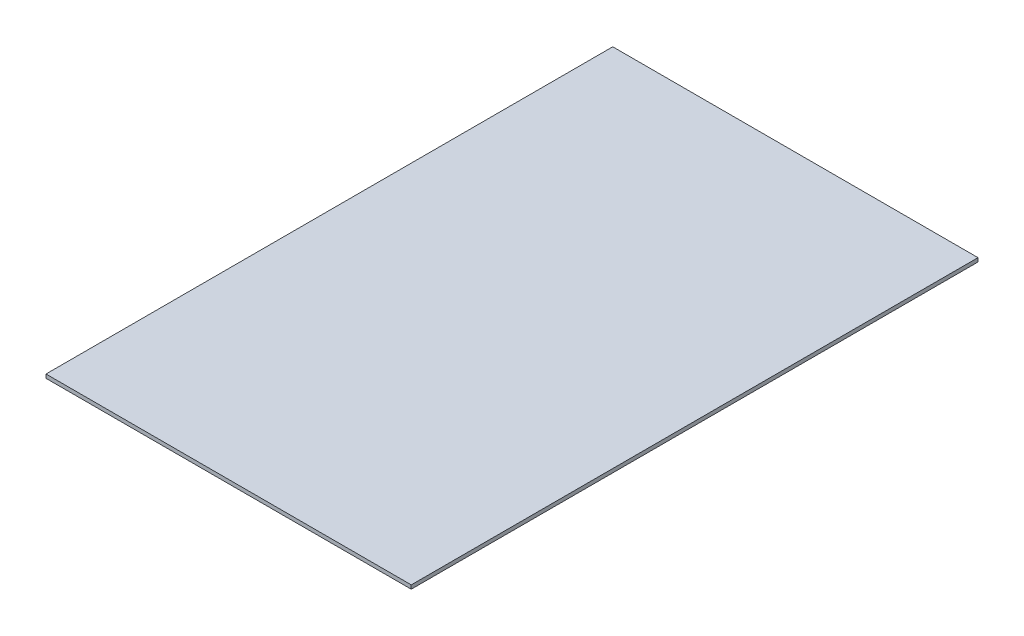
ISO-10303-21;
HEADER;
FILE_DESCRIPTION(('STEP AP214'),'2;1');
FILE_NAME('part.step','',(''),(''),'','','');
FILE_SCHEMA(('AUTOMOTIVE_DESIGN { 1 0 10303 214 1 1 1 1 }'));
ENDSEC;
DATA;
#1=APPLICATION_CONTEXT('core data for automotive mechanical design processes');
#2=APPLICATION_PROTOCOL_DEFINITION('international standard','automotive_design',2000,#1);
#3=PRODUCT_CONTEXT('',#1,'mechanical');
#4=PRODUCT('Part','Part','',(#3));
#5=PRODUCT_RELATED_PRODUCT_CATEGORY('part','',(#4));
#6=PRODUCT_DEFINITION_FORMATION('','',#4);
#7=PRODUCT_DEFINITION_CONTEXT('part definition',#1,'design');
#8=PRODUCT_DEFINITION('design','',#6,#7);
#9=PRODUCT_DEFINITION_SHAPE('','',#8);
#10=(LENGTH_UNIT() NAMED_UNIT(*) SI_UNIT(.MILLI.,.METRE.));
#11=(NAMED_UNIT(*) PLANE_ANGLE_UNIT() SI_UNIT($,.RADIAN.));
#12=(NAMED_UNIT(*) SI_UNIT($,.STERADIAN.) SOLID_ANGLE_UNIT());
#13=UNCERTAINTY_MEASURE_WITH_UNIT(LENGTH_MEASURE(1.E-05),#10,'distance_accuracy_value','');
#14=(GEOMETRIC_REPRESENTATION_CONTEXT(3) GLOBAL_UNCERTAINTY_ASSIGNED_CONTEXT((#13)) GLOBAL_UNIT_ASSIGNED_CONTEXT((#10,
#11,#12)) REPRESENTATION_CONTEXT('',''));
#15=CARTESIAN_POINT('',(0.,0.,0.));
#16=DIRECTION('',(0.,0.,1.));
#17=DIRECTION('',(1.,0.,0.));
#18=AXIS2_PLACEMENT_3D('',#15,#16,#17);
#19=CARTESIAN_POINT('',(0.,6.,0.));
#20=DIRECTION('',(1.,0.,0.));
#21=DIRECTION('',(0.,0.,-1.));
#22=AXIS2_PLACEMENT_3D('',#19,#20,#21);
#23=PLANE('',#22);
#24=DIRECTION('',(0.,0.,1.));
#25=VECTOR('',#24,1.);
#26=CARTESIAN_POINT('',(0.,0.,0.));
#27=LINE('',#26,#25);
#28=CARTESIAN_POINT('',(0.,0.,-900.));
#29=VERTEX_POINT('',#28);
#30=CARTESIAN_POINT('',(0.,0.,0.));
#31=VERTEX_POINT('',#30);
#32=EDGE_CURVE('E96',#29,#31,#27,.T.);
#33=ORIENTED_EDGE('',*,*,#32,.T.);
#34=DIRECTION('',(0.,-1.,0.));
#35=VECTOR('',#34,1.);
#36=CARTESIAN_POINT('',(0.,6.,0.));
#37=LINE('',#36,#35);
#38=CARTESIAN_POINT('',(0.,6.,0.));
#39=VERTEX_POINT('',#38);
#40=EDGE_CURVE('E11',#39,#31,#37,.T.);
#41=ORIENTED_EDGE('',*,*,#40,.F.);
#42=DIRECTION('',(0.,0.,1.));
#43=VECTOR('',#42,1.);
#44=CARTESIAN_POINT('',(0.,6.,0.));
#45=LINE('',#44,#43);
#46=CARTESIAN_POINT('',(0.,6.,-900.));
#47=VERTEX_POINT('',#46);
#48=EDGE_CURVE('E84',#47,#39,#45,.T.);
#49=ORIENTED_EDGE('',*,*,#48,.F.);
#50=DIRECTION('',(0.,-1.,0.));
#51=VECTOR('',#50,1.);
#52=CARTESIAN_POINT('',(0.,6.,-900.));
#53=LINE('',#52,#51);
#54=EDGE_CURVE('E92',#47,#29,#53,.T.);
#55=ORIENTED_EDGE('',*,*,#54,.T.);
#56=EDGE_LOOP('',(#33,#41,#49,#55));
#57=FACE_BOUND('',#56,.T.);
#58=ADVANCED_FACE('F33',(#57),#23,.F.);
#59=CARTESIAN_POINT('',(0.,6.,0.));
#60=DIRECTION('',(0.,0.,-1.));
#61=DIRECTION('',(-1.,0.,0.));
#62=AXIS2_PLACEMENT_3D('',#59,#60,#61);
#63=PLANE('',#62);
#64=DIRECTION('',(1.,0.,0.));
#65=VECTOR('',#64,1.);
#66=CARTESIAN_POINT('',(0.,0.,0.));
#67=LINE('',#66,#65);
#68=CARTESIAN_POINT('',(580.,0.,0.));
#69=VERTEX_POINT('',#68);
#70=EDGE_CURVE('E88',#31,#69,#67,.T.);
#71=ORIENTED_EDGE('',*,*,#70,.T.);
#72=DIRECTION('',(0.,-1.,0.));
#73=VECTOR('',#72,1.);
#74=CARTESIAN_POINT('',(580.,6.,0.));
#75=LINE('',#74,#73);
#76=CARTESIAN_POINT('',(580.,6.,0.));
#77=VERTEX_POINT('',#76);
#78=EDGE_CURVE('E41',#77,#69,#75,.T.);
#79=ORIENTED_EDGE('',*,*,#78,.F.);
#80=DIRECTION('',(1.,0.,0.));
#81=VECTOR('',#80,1.);
#82=CARTESIAN_POINT('',(0.,6.,0.));
#83=LINE('',#82,#81);
#84=EDGE_CURVE('E79',#39,#77,#83,.T.);
#85=ORIENTED_EDGE('',*,*,#84,.F.);
#86=ORIENTED_EDGE('',*,*,#40,.T.);
#87=EDGE_LOOP('',(#71,#79,#85,#86));
#88=FACE_BOUND('',#87,.T.);
#89=ADVANCED_FACE('F87',(#88),#63,.F.);
#90=CARTESIAN_POINT('',(580.,6.,0.));
#91=DIRECTION('',(-1.,0.,0.));
#92=DIRECTION('',(0.,0.,1.));
#93=AXIS2_PLACEMENT_3D('',#90,#91,#92);
#94=PLANE('',#93);
#95=DIRECTION('',(0.,0.,-1.));
#96=VECTOR('',#95,1.);
#97=CARTESIAN_POINT('',(580.,0.,0.));
#98=LINE('',#97,#96);
#99=CARTESIAN_POINT('',(580.,0.,-900.));
#100=VERTEX_POINT('',#99);
#101=EDGE_CURVE('E66',#69,#100,#98,.T.);
#102=ORIENTED_EDGE('',*,*,#101,.T.);
#103=DIRECTION('',(0.,-1.,0.));
#104=VECTOR('',#103,1.);
#105=CARTESIAN_POINT('',(580.,6.,-900.));
#106=LINE('',#105,#104);
#107=CARTESIAN_POINT('',(580.,6.,-900.));
#108=VERTEX_POINT('',#107);
#109=EDGE_CURVE('E89',#108,#100,#106,.T.);
#110=ORIENTED_EDGE('',*,*,#109,.F.);
#111=DIRECTION('',(0.,0.,-1.));
#112=VECTOR('',#111,1.);
#113=CARTESIAN_POINT('',(580.,6.,0.));
#114=LINE('',#113,#112);
#115=EDGE_CURVE('E82',#77,#108,#114,.T.);
#116=ORIENTED_EDGE('',*,*,#115,.F.);
#117=ORIENTED_EDGE('',*,*,#78,.T.);
#118=EDGE_LOOP('',(#102,#110,#116,#117));
#119=FACE_BOUND('',#118,.T.);
#120=ADVANCED_FACE('F90',(#119),#94,.F.);
#121=CARTESIAN_POINT('',(0.,6.,-900.));
#122=DIRECTION('',(0.,0.,1.));
#123=DIRECTION('',(1.,0.,0.));
#124=AXIS2_PLACEMENT_3D('',#121,#122,#123);
#125=PLANE('',#124);
#126=DIRECTION('',(-1.,0.,0.));
#127=VECTOR('',#126,1.);
#128=CARTESIAN_POINT('',(0.,0.,-900.));
#129=LINE('',#128,#127);
#130=EDGE_CURVE('E72',#100,#29,#129,.T.);
#131=ORIENTED_EDGE('',*,*,#130,.T.);
#132=ORIENTED_EDGE('',*,*,#54,.F.);
#133=DIRECTION('',(-1.,0.,0.));
#134=VECTOR('',#133,1.);
#135=CARTESIAN_POINT('',(0.,6.,-900.));
#136=LINE('',#135,#134);
#137=EDGE_CURVE('E49',#108,#47,#136,.T.);
#138=ORIENTED_EDGE('',*,*,#137,.F.);
#139=ORIENTED_EDGE('',*,*,#109,.T.);
#140=EDGE_LOOP('',(#131,#132,#138,#139));
#141=FACE_BOUND('',#140,.T.);
#142=ADVANCED_FACE('F103',(#141),#125,.F.);
#143=CARTESIAN_POINT('',(0.,6.,0.));
#144=DIRECTION('',(0.,-1.,0.));
#145=DIRECTION('',(0.,0.,-1.));
#146=AXIS2_PLACEMENT_3D('',#143,#144,#145);
#147=PLANE('',#146);
#148=ORIENTED_EDGE('',*,*,#48,.T.);
#149=ORIENTED_EDGE('',*,*,#84,.T.);
#150=ORIENTED_EDGE('',*,*,#115,.T.);
#151=ORIENTED_EDGE('',*,*,#137,.T.);
#152=EDGE_LOOP('',(#148,#149,#150,#151));
#153=FACE_BOUND('',#152,.T.);
#154=ADVANCED_FACE('F80',(#153),#147,.F.);
#155=CARTESIAN_POINT('',(0.,0.,0.));
#156=DIRECTION('',(0.,-1.,0.));
#157=DIRECTION('',(0.,0.,-1.));
#158=AXIS2_PLACEMENT_3D('',#155,#156,#157);
#159=PLANE('',#158);
#160=ORIENTED_EDGE('',*,*,#32,.F.);
#161=ORIENTED_EDGE('',*,*,#130,.F.);
#162=ORIENTED_EDGE('',*,*,#101,.F.);
#163=ORIENTED_EDGE('',*,*,#70,.F.);
#164=EDGE_LOOP('',(#160,#161,#162,#163));
#165=FACE_BOUND('',#164,.T.);
#166=ADVANCED_FACE('F106',(#165),#159,.T.);
#167=CLOSED_SHELL('',(#58,#89,#120,#142,#154,#166));
#168=MANIFOLD_SOLID_BREP('B2',#167);
#169=ADVANCED_BREP_SHAPE_REPRESENTATION('',(#18,#168),#14);
#170=SHAPE_DEFINITION_REPRESENTATION(#9,#169);
ENDSEC;
END-ISO-10303-21;
